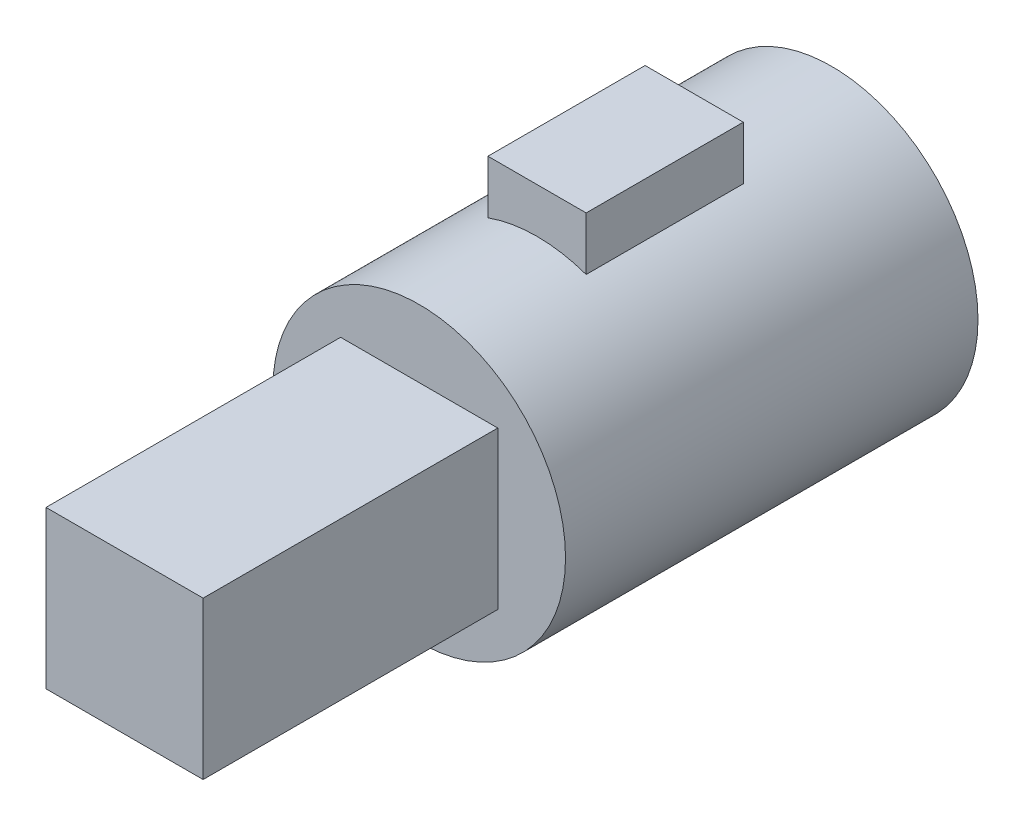
ISO-10303-21;
HEADER;
FILE_DESCRIPTION(('STEP AP214'),'2;1');
FILE_NAME('part.step','',(''),(''),'','','');
FILE_SCHEMA(('AUTOMOTIVE_DESIGN { 1 0 10303 214 1 1 1 1 }'));
ENDSEC;
DATA;
#1=APPLICATION_CONTEXT('core data for automotive mechanical design processes');
#2=APPLICATION_PROTOCOL_DEFINITION('international standard','automotive_design',2000,#1);
#3=PRODUCT_CONTEXT('',#1,'mechanical');
#4=PRODUCT('Part','Part','',(#3));
#5=PRODUCT_RELATED_PRODUCT_CATEGORY('part','',(#4));
#6=PRODUCT_DEFINITION_FORMATION('','',#4);
#7=PRODUCT_DEFINITION_CONTEXT('part definition',#1,'design');
#8=PRODUCT_DEFINITION('design','',#6,#7);
#9=PRODUCT_DEFINITION_SHAPE('','',#8);
#10=(LENGTH_UNIT() NAMED_UNIT(*) SI_UNIT(.MILLI.,.METRE.));
#11=(NAMED_UNIT(*) PLANE_ANGLE_UNIT() SI_UNIT($,.RADIAN.));
#12=(NAMED_UNIT(*) SI_UNIT($,.STERADIAN.) SOLID_ANGLE_UNIT());
#13=UNCERTAINTY_MEASURE_WITH_UNIT(LENGTH_MEASURE(1.E-05),#10,'distance_accuracy_value','');
#14=(GEOMETRIC_REPRESENTATION_CONTEXT(3) GLOBAL_UNCERTAINTY_ASSIGNED_CONTEXT((#13)) GLOBAL_UNIT_ASSIGNED_CONTEXT((#10,
#11,#12)) REPRESENTATION_CONTEXT('',''));
#15=CARTESIAN_POINT('',(0.,0.,0.));
#16=DIRECTION('',(0.,0.,1.));
#17=DIRECTION('',(1.,0.,0.));
#18=AXIS2_PLACEMENT_3D('',#15,#16,#17);
#19=CARTESIAN_POINT('',(0.,0.,21.));
#20=DIRECTION('',(0.,0.,-1.));
#21=DIRECTION('',(-1.,0.,0.));
#22=AXIS2_PLACEMENT_3D('',#19,#20,#21);
#23=CYLINDRICAL_SURFACE('',#22,7.45);
#24=CARTESIAN_POINT('',(0.,0.,0.));
#25=DIRECTION('',(0.,0.,1.));
#26=DIRECTION('',(1.,0.,0.));
#27=AXIS2_PLACEMENT_3D('',#24,#25,#26);
#28=CIRCLE('',#27,7.45);
#29=CARTESIAN_POINT('',(7.45,0.,0.));
#30=VERTEX_POINT('',#29);
#31=EDGE_CURVE('E141',#30,#30,#28,.T.);
#32=ORIENTED_EDGE('',*,*,#31,.T.);
#33=EDGE_LOOP('',(#32));
#34=FACE_BOUND('',#33,.T.);
#35=CARTESIAN_POINT('',(0.,0.,21.));
#36=DIRECTION('',(0.,0.,1.));
#37=DIRECTION('',(1.,0.,0.));
#38=AXIS2_PLACEMENT_3D('',#35,#36,#37);
#39=CIRCLE('',#38,7.45);
#40=CARTESIAN_POINT('',(7.45,0.,21.));
#41=VERTEX_POINT('',#40);
#42=EDGE_CURVE('E144',#41,#41,#39,.T.);
#43=ORIENTED_EDGE('',*,*,#42,.F.);
#44=EDGE_LOOP('',(#43));
#45=FACE_BOUND('',#44,.T.);
#46=CARTESIAN_POINT('',(0.,0.,15.));
#47=DIRECTION('',(0.,0.,-1.));
#48=DIRECTION('',(-1.,0.,0.));
#49=AXIS2_PLACEMENT_3D('',#46,#47,#48);
#50=CIRCLE('',#49,7.45);
#51=CARTESIAN_POINT('',(-2.5,7.01801253917375,15.));
#52=VERTEX_POINT('',#51);
#53=CARTESIAN_POINT('',(2.5,7.01801253917375,15.));
#54=VERTEX_POINT('',#53);
#55=EDGE_CURVE('E11',#52,#54,#50,.T.);
#56=ORIENTED_EDGE('',*,*,#55,.F.);
#57=DIRECTION('',(0.,0.,-1.));
#58=VECTOR('',#57,1.);
#59=CARTESIAN_POINT('',(-2.5,7.01801253917375,21.));
#60=LINE('',#59,#58);
#61=CARTESIAN_POINT('',(-2.5,7.01801253917375,7.));
#62=VERTEX_POINT('',#61);
#63=EDGE_CURVE('E42',#52,#62,#60,.T.);
#64=ORIENTED_EDGE('',*,*,#63,.T.);
#65=CARTESIAN_POINT('',(0.,0.,7.));
#66=DIRECTION('',(0.,0.,-1.));
#67=DIRECTION('',(-1.,0.,0.));
#68=AXIS2_PLACEMENT_3D('',#65,#66,#67);
#69=CIRCLE('',#68,7.45);
#70=CARTESIAN_POINT('',(2.5,7.01801253917375,7.));
#71=VERTEX_POINT('',#70);
#72=EDGE_CURVE('E147',#62,#71,#69,.T.);
#73=ORIENTED_EDGE('',*,*,#72,.T.);
#74=DIRECTION('',(0.,0.,-1.));
#75=VECTOR('',#74,1.);
#76=CARTESIAN_POINT('',(2.5,7.01801253917375,21.));
#77=LINE('',#76,#75);
#78=EDGE_CURVE('E152',#71,#54,#77,.F.);
#79=ORIENTED_EDGE('',*,*,#78,.T.);
#80=EDGE_LOOP('',(#56,#64,#73,#79));
#81=FACE_BOUND('',#80,.T.);
#82=ADVANCED_FACE('F35',(#34,#45,#81),#23,.T.);
#83=CARTESIAN_POINT('',(0.,0.,21.));
#84=DIRECTION('',(0.,0.,1.));
#85=DIRECTION('',(1.,0.,0.));
#86=AXIS2_PLACEMENT_3D('',#83,#84,#85);
#87=PLANE('',#86);
#88=DIRECTION('',(0.,1.,0.));
#89=VECTOR('',#88,1.);
#90=CARTESIAN_POINT('',(4.,-4.,21.));
#91=LINE('',#90,#89);
#92=CARTESIAN_POINT('',(4.,-4.,21.));
#93=VERTEX_POINT('',#92);
#94=CARTESIAN_POINT('',(4.,4.,21.));
#95=VERTEX_POINT('',#94);
#96=EDGE_CURVE('E49',#93,#95,#91,.T.);
#97=ORIENTED_EDGE('',*,*,#96,.F.);
#98=DIRECTION('',(1.,0.,0.));
#99=VECTOR('',#98,1.);
#100=CARTESIAN_POINT('',(-4.,-4.,21.));
#101=LINE('',#100,#99);
#102=CARTESIAN_POINT('',(-4.,-4.,21.));
#103=VERTEX_POINT('',#102);
#104=EDGE_CURVE('E53',#103,#93,#101,.T.);
#105=ORIENTED_EDGE('',*,*,#104,.F.);
#106=DIRECTION('',(0.,-1.,0.));
#107=VECTOR('',#106,1.);
#108=CARTESIAN_POINT('',(-4.,-4.,21.));
#109=LINE('',#108,#107);
#110=CARTESIAN_POINT('',(-4.,4.,21.));
#111=VERTEX_POINT('',#110);
#112=EDGE_CURVE('E288',#111,#103,#109,.T.);
#113=ORIENTED_EDGE('',*,*,#112,.F.);
#114=DIRECTION('',(-1.,0.,0.));
#115=VECTOR('',#114,1.);
#116=CARTESIAN_POINT('',(-4.,4.,21.));
#117=LINE('',#116,#115);
#118=EDGE_CURVE('E294',#95,#111,#117,.T.);
#119=ORIENTED_EDGE('',*,*,#118,.F.);
#120=EDGE_LOOP('',(#97,#105,#113,#119));
#121=FACE_BOUND('',#120,.T.);
#122=ORIENTED_EDGE('',*,*,#42,.T.);
#123=EDGE_LOOP('',(#122));
#124=FACE_BOUND('',#123,.T.);
#125=ADVANCED_FACE('F186',(#121,#124),#87,.T.);
#126=CARTESIAN_POINT('',(0.,0.,0.));
#127=DIRECTION('',(0.,0.,1.));
#128=DIRECTION('',(1.,0.,0.));
#129=AXIS2_PLACEMENT_3D('',#126,#127,#128);
#130=PLANE('',#129);
#131=ORIENTED_EDGE('',*,*,#31,.F.);
#132=EDGE_LOOP('',(#131));
#133=FACE_BOUND('',#132,.T.);
#134=ADVANCED_FACE('F182',(#133),#130,.F.);
#135=CARTESIAN_POINT('',(-2.5,0.,15.));
#136=DIRECTION('',(-1.,0.,0.));
#137=DIRECTION('',(0.,0.,1.));
#138=AXIS2_PLACEMENT_3D('',#135,#136,#137);
#139=PLANE('',#138);
#140=ORIENTED_EDGE('',*,*,#63,.F.);
#141=DIRECTION('',(0.,1.,0.));
#142=VECTOR('',#141,1.);
#143=CARTESIAN_POINT('',(-2.5,0.,15.));
#144=LINE('',#143,#142);
#145=CARTESIAN_POINT('',(-2.5,9.73408958249306,15.));
#146=VERTEX_POINT('',#145);
#147=EDGE_CURVE('E126',#52,#146,#144,.T.);
#148=ORIENTED_EDGE('',*,*,#147,.T.);
#149=DIRECTION('',(0.,0.,-1.));
#150=VECTOR('',#149,1.);
#151=CARTESIAN_POINT('',(-2.5,9.73408958249306,15.));
#152=LINE('',#151,#150);
#153=CARTESIAN_POINT('',(-2.5,9.73408958249306,7.));
#154=VERTEX_POINT('',#153);
#155=EDGE_CURVE('E134',#146,#154,#152,.T.);
#156=ORIENTED_EDGE('',*,*,#155,.T.);
#157=DIRECTION('',(0.,1.,0.));
#158=VECTOR('',#157,1.);
#159=CARTESIAN_POINT('',(-2.5,0.,7.));
#160=LINE('',#159,#158);
#161=EDGE_CURVE('E118',#62,#154,#160,.T.);
#162=ORIENTED_EDGE('',*,*,#161,.F.);
#163=EDGE_LOOP('',(#140,#148,#156,#162));
#164=FACE_BOUND('',#163,.T.);
#165=ADVANCED_FACE('F160',(#164),#139,.T.);
#166=CARTESIAN_POINT('',(2.5,0.,15.));
#167=DIRECTION('',(1.,0.,0.));
#168=DIRECTION('',(0.,0.,-1.));
#169=AXIS2_PLACEMENT_3D('',#166,#167,#168);
#170=PLANE('',#169);
#171=ORIENTED_EDGE('',*,*,#78,.F.);
#172=DIRECTION('',(0.,-1.,0.));
#173=VECTOR('',#172,1.);
#174=CARTESIAN_POINT('',(2.5,0.,7.));
#175=LINE('',#174,#173);
#176=CARTESIAN_POINT('',(2.5,9.73408958249306,7.));
#177=VERTEX_POINT('',#176);
#178=EDGE_CURVE('E129',#177,#71,#175,.T.);
#179=ORIENTED_EDGE('',*,*,#178,.F.);
#180=DIRECTION('',(0.,0.,-1.));
#181=VECTOR('',#180,1.);
#182=CARTESIAN_POINT('',(2.5,9.73408958249306,15.));
#183=LINE('',#182,#181);
#184=CARTESIAN_POINT('',(2.5,9.73408958249306,15.));
#185=VERTEX_POINT('',#184);
#186=EDGE_CURVE('E139',#185,#177,#183,.T.);
#187=ORIENTED_EDGE('',*,*,#186,.F.);
#188=DIRECTION('',(0.,-1.,0.));
#189=VECTOR('',#188,1.);
#190=CARTESIAN_POINT('',(2.5,0.,15.));
#191=LINE('',#190,#189);
#192=EDGE_CURVE('E132',#185,#54,#191,.T.);
#193=ORIENTED_EDGE('',*,*,#192,.T.);
#194=EDGE_LOOP('',(#171,#179,#187,#193));
#195=FACE_BOUND('',#194,.T.);
#196=ADVANCED_FACE('F174',(#195),#170,.T.);
#197=CARTESIAN_POINT('',(-2.5,9.73408958249306,15.));
#198=DIRECTION('',(0.,1.,0.));
#199=DIRECTION('',(0.,0.,1.));
#200=AXIS2_PLACEMENT_3D('',#197,#198,#199);
#201=PLANE('',#200);
#202=DIRECTION('',(1.,0.,0.));
#203=VECTOR('',#202,1.);
#204=CARTESIAN_POINT('',(-2.5,9.73408958249306,7.));
#205=LINE('',#204,#203);
#206=EDGE_CURVE('E120',#154,#177,#205,.T.);
#207=ORIENTED_EDGE('',*,*,#206,.F.);
#208=ORIENTED_EDGE('',*,*,#155,.F.);
#209=DIRECTION('',(1.,0.,0.));
#210=VECTOR('',#209,1.);
#211=CARTESIAN_POINT('',(-2.5,9.73408958249306,15.));
#212=LINE('',#211,#210);
#213=EDGE_CURVE('E128',#146,#185,#212,.T.);
#214=ORIENTED_EDGE('',*,*,#213,.T.);
#215=ORIENTED_EDGE('',*,*,#186,.T.);
#216=EDGE_LOOP('',(#207,#208,#214,#215));
#217=FACE_BOUND('',#216,.T.);
#218=ADVANCED_FACE('F168',(#217),#201,.T.);
#219=CARTESIAN_POINT('',(0.,0.,15.));
#220=DIRECTION('',(0.,0.,-1.));
#221=DIRECTION('',(-1.,0.,0.));
#222=AXIS2_PLACEMENT_3D('',#219,#220,#221);
#223=PLANE('',#222);
#224=ORIENTED_EDGE('',*,*,#147,.F.);
#225=ORIENTED_EDGE('',*,*,#55,.T.);
#226=ORIENTED_EDGE('',*,*,#192,.F.);
#227=ORIENTED_EDGE('',*,*,#213,.F.);
#228=EDGE_LOOP('',(#224,#225,#226,#227));
#229=FACE_BOUND('',#228,.T.);
#230=ADVANCED_FACE('F164',(#229),#223,.F.);
#231=CARTESIAN_POINT('',(0.,0.,7.));
#232=DIRECTION('',(0.,0.,-1.));
#233=DIRECTION('',(-1.,0.,0.));
#234=AXIS2_PLACEMENT_3D('',#231,#232,#233);
#235=PLANE('',#234);
#236=ORIENTED_EDGE('',*,*,#72,.F.);
#237=ORIENTED_EDGE('',*,*,#161,.T.);
#238=ORIENTED_EDGE('',*,*,#206,.T.);
#239=ORIENTED_EDGE('',*,*,#178,.T.);
#240=EDGE_LOOP('',(#236,#237,#238,#239));
#241=FACE_BOUND('',#240,.T.);
#242=ADVANCED_FACE('F171',(#241),#235,.T.);
#243=CARTESIAN_POINT('',(4.,-4.,36.));
#244=DIRECTION('',(-1.,0.,0.));
#245=DIRECTION('',(0.,0.,1.));
#246=AXIS2_PLACEMENT_3D('',#243,#244,#245);
#247=PLANE('',#246);
#248=ORIENTED_EDGE('',*,*,#96,.T.);
#249=DIRECTION('',(0.,0.,-1.));
#250=VECTOR('',#249,1.);
#251=CARTESIAN_POINT('',(4.,4.,36.));
#252=LINE('',#251,#250);
#253=CARTESIAN_POINT('',(4.,4.,36.));
#254=VERTEX_POINT('',#253);
#255=EDGE_CURVE('E101',#254,#95,#252,.T.);
#256=ORIENTED_EDGE('',*,*,#255,.F.);
#257=DIRECTION('',(0.,1.,0.));
#258=VECTOR('',#257,1.);
#259=CARTESIAN_POINT('',(4.,-4.,36.));
#260=LINE('',#259,#258);
#261=CARTESIAN_POINT('',(4.,-4.,36.));
#262=VERTEX_POINT('',#261);
#263=EDGE_CURVE('E107',#262,#254,#260,.T.);
#264=ORIENTED_EDGE('',*,*,#263,.F.);
#265=DIRECTION('',(0.,0.,-1.));
#266=VECTOR('',#265,1.);
#267=CARTESIAN_POINT('',(4.,-4.,36.));
#268=LINE('',#267,#266);
#269=EDGE_CURVE('E286',#262,#93,#268,.T.);
#270=ORIENTED_EDGE('',*,*,#269,.T.);
#271=EDGE_LOOP('',(#248,#256,#264,#270));
#272=FACE_BOUND('',#271,.T.);
#273=ADVANCED_FACE('F117',(#272),#247,.F.);
#274=CARTESIAN_POINT('',(-4.,4.,36.));
#275=DIRECTION('',(0.,-1.,0.));
#276=DIRECTION('',(0.,0.,-1.));
#277=AXIS2_PLACEMENT_3D('',#274,#275,#276);
#278=PLANE('',#277);
#279=ORIENTED_EDGE('',*,*,#118,.T.);
#280=DIRECTION('',(0.,0.,-1.));
#281=VECTOR('',#280,1.);
#282=CARTESIAN_POINT('',(-4.,4.,36.));
#283=LINE('',#282,#281);
#284=CARTESIAN_POINT('',(-4.,4.,36.));
#285=VERTEX_POINT('',#284);
#286=EDGE_CURVE('E103',#285,#111,#283,.T.);
#287=ORIENTED_EDGE('',*,*,#286,.F.);
#288=DIRECTION('',(-1.,0.,0.));
#289=VECTOR('',#288,1.);
#290=CARTESIAN_POINT('',(-4.,4.,36.));
#291=LINE('',#290,#289);
#292=EDGE_CURVE('E96',#254,#285,#291,.T.);
#293=ORIENTED_EDGE('',*,*,#292,.F.);
#294=ORIENTED_EDGE('',*,*,#255,.T.);
#295=EDGE_LOOP('',(#279,#287,#293,#294));
#296=FACE_BOUND('',#295,.T.);
#297=ADVANCED_FACE('F99',(#296),#278,.F.);
#298=CARTESIAN_POINT('',(-4.,-4.,36.));
#299=DIRECTION('',(1.,0.,0.));
#300=DIRECTION('',(0.,0.,-1.));
#301=AXIS2_PLACEMENT_3D('',#298,#299,#300);
#302=PLANE('',#301);
#303=ORIENTED_EDGE('',*,*,#112,.T.);
#304=DIRECTION('',(0.,0.,-1.));
#305=VECTOR('',#304,1.);
#306=CARTESIAN_POINT('',(-4.,-4.,36.));
#307=LINE('',#306,#305);
#308=CARTESIAN_POINT('',(-4.,-4.,36.));
#309=VERTEX_POINT('',#308);
#310=EDGE_CURVE('E122',#309,#103,#307,.T.);
#311=ORIENTED_EDGE('',*,*,#310,.F.);
#312=DIRECTION('',(0.,-1.,0.));
#313=VECTOR('',#312,1.);
#314=CARTESIAN_POINT('',(-4.,-4.,36.));
#315=LINE('',#314,#313);
#316=EDGE_CURVE('E106',#285,#309,#315,.T.);
#317=ORIENTED_EDGE('',*,*,#316,.F.);
#318=ORIENTED_EDGE('',*,*,#286,.T.);
#319=EDGE_LOOP('',(#303,#311,#317,#318));
#320=FACE_BOUND('',#319,.T.);
#321=ADVANCED_FACE('F254',(#320),#302,.F.);
#322=CARTESIAN_POINT('',(-4.,-4.,36.));
#323=DIRECTION('',(0.,1.,0.));
#324=DIRECTION('',(0.,0.,1.));
#325=AXIS2_PLACEMENT_3D('',#322,#323,#324);
#326=PLANE('',#325);
#327=ORIENTED_EDGE('',*,*,#104,.T.);
#328=ORIENTED_EDGE('',*,*,#269,.F.);
#329=DIRECTION('',(1.,0.,0.));
#330=VECTOR('',#329,1.);
#331=CARTESIAN_POINT('',(-4.,-4.,36.));
#332=LINE('',#331,#330);
#333=EDGE_CURVE('E112',#309,#262,#332,.T.);
#334=ORIENTED_EDGE('',*,*,#333,.F.);
#335=ORIENTED_EDGE('',*,*,#310,.T.);
#336=EDGE_LOOP('',(#327,#328,#334,#335));
#337=FACE_BOUND('',#336,.T.);
#338=ADVANCED_FACE('F263',(#337),#326,.F.);
#339=CARTESIAN_POINT('',(0.,0.,36.));
#340=DIRECTION('',(0.,0.,-1.));
#341=DIRECTION('',(-1.,0.,0.));
#342=AXIS2_PLACEMENT_3D('',#339,#340,#341);
#343=PLANE('',#342);
#344=ORIENTED_EDGE('',*,*,#263,.T.);
#345=ORIENTED_EDGE('',*,*,#292,.T.);
#346=ORIENTED_EDGE('',*,*,#316,.T.);
#347=ORIENTED_EDGE('',*,*,#333,.T.);
#348=EDGE_LOOP('',(#344,#345,#346,#347));
#349=FACE_BOUND('',#348,.T.);
#350=ADVANCED_FACE('F110',(#349),#343,.F.);
#351=CLOSED_SHELL('',(#82,#125,#134,#165,#196,#218,#230,#242,#273,#297,#321,#338,#350));
#352=MANIFOLD_SOLID_BREP('B2',#351);
#353=ADVANCED_BREP_SHAPE_REPRESENTATION('',(#18,#352),#14);
#354=SHAPE_DEFINITION_REPRESENTATION(#9,#353);
ENDSEC;
END-ISO-10303-21;
